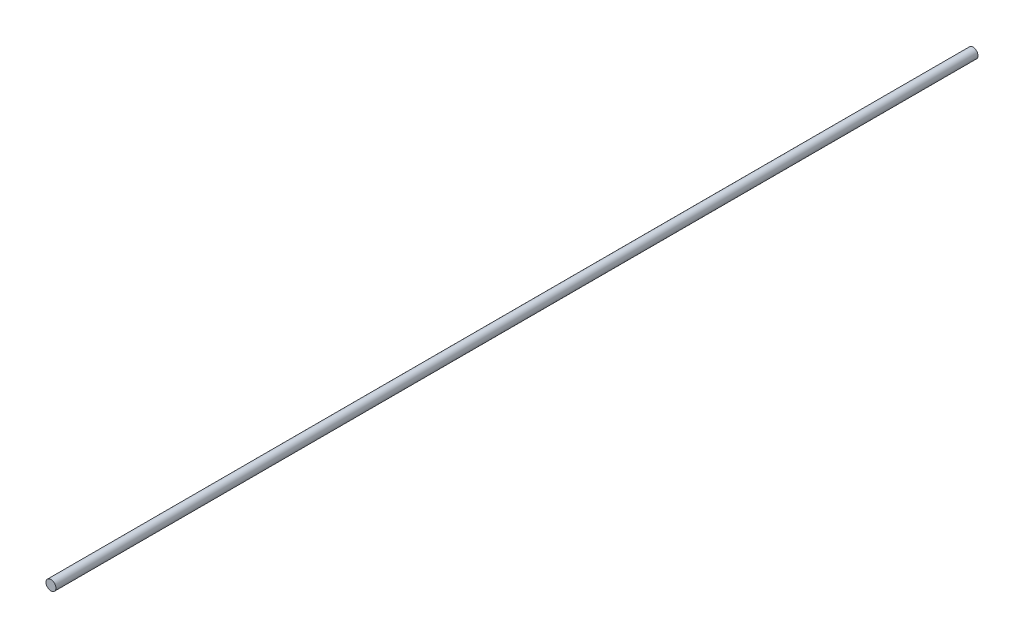
ISO-10303-21;
HEADER;
FILE_DESCRIPTION(('STEP AP214'),'2;1');
FILE_NAME('part.step','',(''),(''),'','','');
FILE_SCHEMA(('AUTOMOTIVE_DESIGN { 1 0 10303 214 1 1 1 1 }'));
ENDSEC;
DATA;
#1=APPLICATION_CONTEXT('core data for automotive mechanical design processes');
#2=APPLICATION_PROTOCOL_DEFINITION('international standard','automotive_design',2000,#1);
#3=PRODUCT_CONTEXT('',#1,'mechanical');
#4=PRODUCT('Part','Part','',(#3));
#5=PRODUCT_RELATED_PRODUCT_CATEGORY('part','',(#4));
#6=PRODUCT_DEFINITION_FORMATION('','',#4);
#7=PRODUCT_DEFINITION_CONTEXT('part definition',#1,'design');
#8=PRODUCT_DEFINITION('design','',#6,#7);
#9=PRODUCT_DEFINITION_SHAPE('','',#8);
#10=(LENGTH_UNIT() NAMED_UNIT(*) SI_UNIT(.MILLI.,.METRE.));
#11=(NAMED_UNIT(*) PLANE_ANGLE_UNIT() SI_UNIT($,.RADIAN.));
#12=(NAMED_UNIT(*) SI_UNIT($,.STERADIAN.) SOLID_ANGLE_UNIT());
#13=UNCERTAINTY_MEASURE_WITH_UNIT(LENGTH_MEASURE(1.E-05),#10,'distance_accuracy_value','');
#14=(GEOMETRIC_REPRESENTATION_CONTEXT(3) GLOBAL_UNCERTAINTY_ASSIGNED_CONTEXT((#13)) GLOBAL_UNIT_ASSIGNED_CONTEXT((#10,
#11,#12)) REPRESENTATION_CONTEXT('',''));
#15=CARTESIAN_POINT('',(0.,0.,0.));
#16=DIRECTION('',(0.,0.,1.));
#17=DIRECTION('',(1.,0.,0.));
#18=AXIS2_PLACEMENT_3D('',#15,#16,#17);
#19=CARTESIAN_POINT('',(0.,0.,-1178.306));
#20=DIRECTION('',(0.,0.,1.));
#21=DIRECTION('',(1.,0.,0.));
#22=AXIS2_PLACEMENT_3D('',#19,#20,#21);
#23=CYLINDRICAL_SURFACE('',#22,6.35);
#24=CARTESIAN_POINT('',(0.,0.,-1178.306));
#25=DIRECTION('',(0.,0.,1.));
#26=DIRECTION('',(1.,0.,0.));
#27=AXIS2_PLACEMENT_3D('',#24,#25,#26);
#28=CIRCLE('',#27,6.35);
#29=CARTESIAN_POINT('',(6.35,0.,-1178.306));
#30=VERTEX_POINT('',#29);
#31=EDGE_CURVE('E10',#30,#30,#28,.T.);
#32=ORIENTED_EDGE('',*,*,#31,.T.);
#33=EDGE_LOOP('',(#32));
#34=FACE_BOUND('',#33,.T.);
#35=CARTESIAN_POINT('',(0.,0.,0.));
#36=DIRECTION('',(0.,0.,1.));
#37=DIRECTION('',(1.,0.,0.));
#38=AXIS2_PLACEMENT_3D('',#35,#36,#37);
#39=CIRCLE('',#38,6.35);
#40=CARTESIAN_POINT('',(6.35,0.,0.));
#41=VERTEX_POINT('',#40);
#42=EDGE_CURVE('E46',#41,#41,#39,.T.);
#43=ORIENTED_EDGE('',*,*,#42,.F.);
#44=EDGE_LOOP('',(#43));
#45=FACE_BOUND('',#44,.T.);
#46=ADVANCED_FACE('F43',(#34,#45),#23,.T.);
#47=CARTESIAN_POINT('',(0.,0.,-1178.306));
#48=DIRECTION('',(0.,0.,1.));
#49=DIRECTION('',(1.,0.,0.));
#50=AXIS2_PLACEMENT_3D('',#47,#48,#49);
#51=PLANE('',#50);
#52=ORIENTED_EDGE('',*,*,#31,.F.);
#53=EDGE_LOOP('',(#52));
#54=FACE_BOUND('',#53,.T.);
#55=ADVANCED_FACE('F59',(#54),#51,.F.);
#56=CARTESIAN_POINT('',(0.,0.,0.));
#57=DIRECTION('',(0.,0.,1.));
#58=DIRECTION('',(1.,0.,0.));
#59=AXIS2_PLACEMENT_3D('',#56,#57,#58);
#60=PLANE('',#59);
#61=ORIENTED_EDGE('',*,*,#42,.T.);
#62=EDGE_LOOP('',(#61));
#63=FACE_BOUND('',#62,.T.);
#64=ADVANCED_FACE('F54',(#63),#60,.T.);
#65=CLOSED_SHELL('',(#46,#55,#64));
#66=MANIFOLD_SOLID_BREP('B2',#65);
#67=ADVANCED_BREP_SHAPE_REPRESENTATION('',(#18,#66),#14);
#68=SHAPE_DEFINITION_REPRESENTATION(#9,#67);
ENDSEC;
END-ISO-10303-21;
